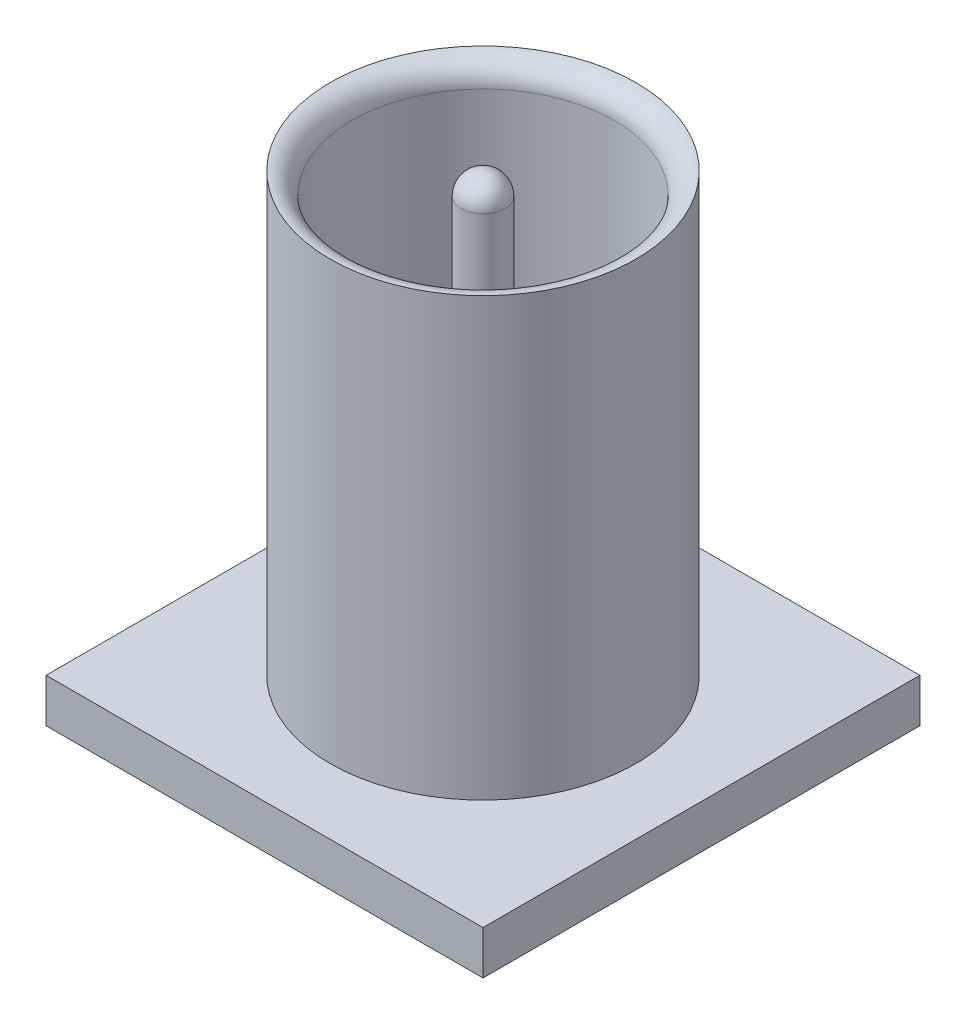
ISO-10303-21;
HEADER;
FILE_DESCRIPTION(('STEP AP214'),'2;1');
FILE_NAME('part.step','',(''),(''),'','','');
FILE_SCHEMA(('AUTOMOTIVE_DESIGN { 1 0 10303 214 1 1 1 1 }'));
ENDSEC;
DATA;
#1=APPLICATION_CONTEXT('core data for automotive mechanical design processes');
#2=APPLICATION_PROTOCOL_DEFINITION('international standard','automotive_design',2000,#1);
#3=PRODUCT_CONTEXT('',#1,'mechanical');
#4=PRODUCT('Part','Part','',(#3));
#5=PRODUCT_RELATED_PRODUCT_CATEGORY('part','',(#4));
#6=PRODUCT_DEFINITION_FORMATION('','',#4);
#7=PRODUCT_DEFINITION_CONTEXT('part definition',#1,'design');
#8=PRODUCT_DEFINITION('design','',#6,#7);
#9=PRODUCT_DEFINITION_SHAPE('','',#8);
#10=(LENGTH_UNIT() NAMED_UNIT(*) SI_UNIT(.MILLI.,.METRE.));
#11=(NAMED_UNIT(*) PLANE_ANGLE_UNIT() SI_UNIT($,.RADIAN.));
#12=(NAMED_UNIT(*) SI_UNIT($,.STERADIAN.) SOLID_ANGLE_UNIT());
#13=UNCERTAINTY_MEASURE_WITH_UNIT(LENGTH_MEASURE(1.E-05),#10,'distance_accuracy_value','');
#14=(GEOMETRIC_REPRESENTATION_CONTEXT(3) GLOBAL_UNCERTAINTY_ASSIGNED_CONTEXT((#13)) GLOBAL_UNIT_ASSIGNED_CONTEXT((#10,
#11,#12)) REPRESENTATION_CONTEXT('',''));
#15=CARTESIAN_POINT('',(0.,0.,0.));
#16=DIRECTION('',(0.,0.,1.));
#17=DIRECTION('',(1.,0.,0.));
#18=AXIS2_PLACEMENT_3D('',#15,#16,#17);
#19=CARTESIAN_POINT('',(0.,1.,0.));
#20=DIRECTION('',(0.,1.,0.));
#21=DIRECTION('',(0.,0.,1.));
#22=AXIS2_PLACEMENT_3D('',#19,#20,#21);
#23=PLANE('',#22);
#24=CARTESIAN_POINT('',(0.,1.,0.));
#25=DIRECTION('',(0.,1.,0.));
#26=DIRECTION('',(0.,0.,1.));
#27=AXIS2_PLACEMENT_3D('',#24,#25,#26);
#28=CIRCLE('',#27,3.);
#29=CARTESIAN_POINT('',(0.,1.,3.));
#30=VERTEX_POINT('',#29);
#31=EDGE_CURVE('E120',#30,#30,#28,.T.);
#32=ORIENTED_EDGE('',*,*,#31,.T.);
#33=EDGE_LOOP('',(#32));
#34=FACE_BOUND('',#33,.T.);
#35=CARTESIAN_POINT('',(0.,1.,0.));
#36=DIRECTION('',(0.,1.,0.));
#37=DIRECTION('',(0.,0.,1.));
#38=AXIS2_PLACEMENT_3D('',#35,#36,#37);
#39=CIRCLE('',#38,0.5);
#40=CARTESIAN_POINT('',(0.,1.,0.5));
#41=VERTEX_POINT('',#40);
#42=EDGE_CURVE('E117',#41,#41,#39,.T.);
#43=ORIENTED_EDGE('',*,*,#42,.F.);
#44=EDGE_LOOP('',(#43));
#45=FACE_BOUND('',#44,.T.);
#46=ADVANCED_FACE('F37',(#34,#45),#23,.T.);
#47=CARTESIAN_POINT('',(0.,10.,0.));
#48=DIRECTION('',(0.,-1.,0.));
#49=DIRECTION('',(0.,0.,-1.));
#50=AXIS2_PLACEMENT_3D('',#47,#48,#49);
#51=CYLINDRICAL_SURFACE('',#50,3.5);
#52=CARTESIAN_POINT('',(0.,10.,0.));
#53=DIRECTION('',(0.,1.,0.));
#54=DIRECTION('',(0.,0.,1.));
#55=AXIS2_PLACEMENT_3D('',#52,#53,#54);
#56=CIRCLE('',#55,3.5);
#57=CARTESIAN_POINT('',(0.,10.,3.5));
#58=VERTEX_POINT('',#57);
#59=EDGE_CURVE('E123',#58,#58,#56,.T.);
#60=ORIENTED_EDGE('',*,*,#59,.F.);
#61=EDGE_LOOP('',(#60));
#62=FACE_BOUND('',#61,.T.);
#63=CARTESIAN_POINT('',(0.,0.,0.));
#64=DIRECTION('',(0.,-1.,0.));
#65=DIRECTION('',(0.,0.,-1.));
#66=AXIS2_PLACEMENT_3D('',#63,#64,#65);
#67=CIRCLE('',#66,3.5);
#68=CARTESIAN_POINT('',(0.,0.,-3.5));
#69=VERTEX_POINT('',#68);
#70=EDGE_CURVE('E114',#69,#69,#67,.T.);
#71=ORIENTED_EDGE('',*,*,#70,.F.);
#72=EDGE_LOOP('',(#71));
#73=FACE_BOUND('',#72,.T.);
#74=ADVANCED_FACE('F143',(#62,#73),#51,.T.);
#75=CARTESIAN_POINT('',(0.,1.,0.));
#76=DIRECTION('',(0.,1.,0.));
#77=DIRECTION('',(0.,0.,1.));
#78=AXIS2_PLACEMENT_3D('',#75,#76,#77);
#79=CYLINDRICAL_SURFACE('',#78,3.);
#80=CARTESIAN_POINT('',(0.,9.5,0.));
#81=DIRECTION('',(0.,1.,0.));
#82=DIRECTION('',(0.,0.,1.));
#83=AXIS2_PLACEMENT_3D('',#80,#81,#82);
#84=CIRCLE('',#83,3.);
#85=CARTESIAN_POINT('',(0.,9.5,3.));
#86=VERTEX_POINT('',#85);
#87=EDGE_CURVE('E11',#86,#86,#84,.T.);
#88=ORIENTED_EDGE('',*,*,#87,.T.);
#89=EDGE_LOOP('',(#88));
#90=FACE_BOUND('',#89,.T.);
#91=ORIENTED_EDGE('',*,*,#31,.F.);
#92=EDGE_LOOP('',(#91));
#93=FACE_BOUND('',#92,.T.);
#94=ADVANCED_FACE('F139',(#90,#93),#79,.F.);
#95=CARTESIAN_POINT('',(0.,10.,0.));
#96=DIRECTION('',(0.,-1.,0.));
#97=DIRECTION('',(0.,0.,-1.));
#98=AXIS2_PLACEMENT_3D('',#95,#96,#97);
#99=CYLINDRICAL_SURFACE('',#98,0.5);
#100=CARTESIAN_POINT('',(0.,9.5,0.));
#101=DIRECTION('',(0.,-1.,0.));
#102=DIRECTION('',(0.,0.,-1.));
#103=AXIS2_PLACEMENT_3D('',#100,#101,#102);
#104=CIRCLE('',#103,0.5);
#105=CARTESIAN_POINT('',(0.,9.5,-0.5));
#106=VERTEX_POINT('',#105);
#107=EDGE_CURVE('E46',#106,#106,#104,.T.);
#108=ORIENTED_EDGE('',*,*,#107,.T.);
#109=EDGE_LOOP('',(#108));
#110=FACE_BOUND('',#109,.T.);
#111=ORIENTED_EDGE('',*,*,#42,.T.);
#112=EDGE_LOOP('',(#111));
#113=FACE_BOUND('',#112,.T.);
#114=ADVANCED_FACE('F128',(#110,#113),#99,.T.);
#115=CARTESIAN_POINT('',(0.,9.5,0.));
#116=DIRECTION('',(0.,0.,1.));
#117=DIRECTION('',(1.,0.,0.));
#118=AXIS2_PLACEMENT_3D('',#115,#116,#117);
#119=SPHERICAL_SURFACE('',#118,0.5);
#120=CARTESIAN_POINT('',(0.,9.5,0.));
#121=DIRECTION('',(0.,-1.,0.));
#122=DIRECTION('',(0.,0.,-1.));
#123=AXIS2_PLACEMENT_3D('',#120,#121,#122);
#124=SPHERICAL_SURFACE('',#123,0.5);
#125=ORIENTED_EDGE('',*,*,#107,.F.);
#126=EDGE_LOOP('',(#125));
#127=FACE_BOUND('',#126,.T.);
#128=ADVANCED_FACE('F131',(#127),#124,.T.);
#129=CARTESIAN_POINT('',(0.,9.5,0.));
#130=DIRECTION('',(0.,1.,0.));
#131=DIRECTION('',(0.,0.,1.));
#132=AXIS2_PLACEMENT_3D('',#129,#130,#131);
#133=TOROIDAL_SURFACE('',#132,3.5,0.5);
#134=ORIENTED_EDGE('',*,*,#59,.T.);
#135=EDGE_LOOP('',(#134));
#136=FACE_BOUND('',#135,.T.);
#137=ORIENTED_EDGE('',*,*,#87,.F.);
#138=EDGE_LOOP('',(#137));
#139=FACE_BOUND('',#138,.T.);
#140=ADVANCED_FACE('F39',(#136,#139),#133,.T.);
#141=CARTESIAN_POINT('',(0.,0.,0.));
#142=DIRECTION('',(0.,-1.,0.));
#143=DIRECTION('',(0.,0.,-1.));
#144=AXIS2_PLACEMENT_3D('',#141,#142,#143);
#145=PLANE('',#144);
#146=DIRECTION('',(0.,0.,-1.));
#147=VECTOR('',#146,1.);
#148=CARTESIAN_POINT('',(-5.,0.,-5.));
#149=LINE('',#148,#147);
#150=CARTESIAN_POINT('',(-5.,0.,5.));
#151=VERTEX_POINT('',#150);
#152=CARTESIAN_POINT('',(-5.,0.,-5.));
#153=VERTEX_POINT('',#152);
#154=EDGE_CURVE('E105',#151,#153,#149,.T.);
#155=ORIENTED_EDGE('',*,*,#154,.F.);
#156=DIRECTION('',(-1.,0.,0.));
#157=VECTOR('',#156,1.);
#158=CARTESIAN_POINT('',(5.,0.,5.));
#159=LINE('',#158,#157);
#160=CARTESIAN_POINT('',(5.,0.,5.));
#161=VERTEX_POINT('',#160);
#162=EDGE_CURVE('E77',#161,#151,#159,.T.);
#163=ORIENTED_EDGE('',*,*,#162,.F.);
#164=DIRECTION('',(0.,0.,1.));
#165=VECTOR('',#164,1.);
#166=CARTESIAN_POINT('',(5.,0.,-5.));
#167=LINE('',#166,#165);
#168=CARTESIAN_POINT('',(5.,0.,-5.));
#169=VERTEX_POINT('',#168);
#170=EDGE_CURVE('E71',#169,#161,#167,.T.);
#171=ORIENTED_EDGE('',*,*,#170,.F.);
#172=DIRECTION('',(1.,0.,0.));
#173=VECTOR('',#172,1.);
#174=CARTESIAN_POINT('',(5.,0.,-5.));
#175=LINE('',#174,#173);
#176=EDGE_CURVE('E95',#153,#169,#175,.T.);
#177=ORIENTED_EDGE('',*,*,#176,.F.);
#178=EDGE_LOOP('',(#155,#163,#171,#177));
#179=FACE_BOUND('',#178,.T.);
#180=ORIENTED_EDGE('',*,*,#70,.T.);
#181=EDGE_LOOP('',(#180));
#182=FACE_BOUND('',#181,.T.);
#183=ADVANCED_FACE('F137',(#179,#182),#145,.F.);
#184=CARTESIAN_POINT('',(-5.,-1.,-5.));
#185=DIRECTION('',(1.,0.,0.));
#186=DIRECTION('',(0.,0.,-1.));
#187=AXIS2_PLACEMENT_3D('',#184,#185,#186);
#188=PLANE('',#187);
#189=ORIENTED_EDGE('',*,*,#154,.T.);
#190=DIRECTION('',(0.,1.,0.));
#191=VECTOR('',#190,1.);
#192=CARTESIAN_POINT('',(-5.,-1.,-5.));
#193=LINE('',#192,#191);
#194=CARTESIAN_POINT('',(-5.,-1.,-5.));
#195=VERTEX_POINT('',#194);
#196=EDGE_CURVE('E96',#195,#153,#193,.T.);
#197=ORIENTED_EDGE('',*,*,#196,.F.);
#198=DIRECTION('',(0.,0.,-1.));
#199=VECTOR('',#198,1.);
#200=CARTESIAN_POINT('',(-5.,-1.,-5.));
#201=LINE('',#200,#199);
#202=CARTESIAN_POINT('',(-5.,-1.,5.));
#203=VERTEX_POINT('',#202);
#204=EDGE_CURVE('E90',#203,#195,#201,.T.);
#205=ORIENTED_EDGE('',*,*,#204,.F.);
#206=DIRECTION('',(0.,1.,0.));
#207=VECTOR('',#206,1.);
#208=CARTESIAN_POINT('',(-5.,-1.,5.));
#209=LINE('',#208,#207);
#210=EDGE_CURVE('E101',#203,#151,#209,.T.);
#211=ORIENTED_EDGE('',*,*,#210,.T.);
#212=EDGE_LOOP('',(#189,#197,#205,#211));
#213=FACE_BOUND('',#212,.T.);
#214=ADVANCED_FACE('F187',(#213),#188,.F.);
#215=CARTESIAN_POINT('',(5.,-1.,-5.));
#216=DIRECTION('',(0.,0.,1.));
#217=DIRECTION('',(1.,0.,0.));
#218=AXIS2_PLACEMENT_3D('',#215,#216,#217);
#219=PLANE('',#218);
#220=ORIENTED_EDGE('',*,*,#176,.T.);
#221=DIRECTION('',(0.,1.,0.));
#222=VECTOR('',#221,1.);
#223=CARTESIAN_POINT('',(5.,-1.,-5.));
#224=LINE('',#223,#222);
#225=CARTESIAN_POINT('',(5.,-1.,-5.));
#226=VERTEX_POINT('',#225);
#227=EDGE_CURVE('E93',#226,#169,#224,.T.);
#228=ORIENTED_EDGE('',*,*,#227,.F.);
#229=DIRECTION('',(1.,0.,0.));
#230=VECTOR('',#229,1.);
#231=CARTESIAN_POINT('',(5.,-1.,-5.));
#232=LINE('',#231,#230);
#233=EDGE_CURVE('E85',#195,#226,#232,.T.);
#234=ORIENTED_EDGE('',*,*,#233,.F.);
#235=ORIENTED_EDGE('',*,*,#196,.T.);
#236=EDGE_LOOP('',(#220,#228,#234,#235));
#237=FACE_BOUND('',#236,.T.);
#238=ADVANCED_FACE('F94',(#237),#219,.F.);
#239=CARTESIAN_POINT('',(5.,-1.,-5.));
#240=DIRECTION('',(-1.,0.,0.));
#241=DIRECTION('',(0.,0.,1.));
#242=AXIS2_PLACEMENT_3D('',#239,#240,#241);
#243=PLANE('',#242);
#244=ORIENTED_EDGE('',*,*,#170,.T.);
#245=DIRECTION('',(0.,1.,0.));
#246=VECTOR('',#245,1.);
#247=CARTESIAN_POINT('',(5.,-1.,5.));
#248=LINE('',#247,#246);
#249=CARTESIAN_POINT('',(5.,-1.,5.));
#250=VERTEX_POINT('',#249);
#251=EDGE_CURVE('E97',#250,#161,#248,.T.);
#252=ORIENTED_EDGE('',*,*,#251,.F.);
#253=DIRECTION('',(0.,0.,1.));
#254=VECTOR('',#253,1.);
#255=CARTESIAN_POINT('',(5.,-1.,-5.));
#256=LINE('',#255,#254);
#257=EDGE_CURVE('E88',#226,#250,#256,.T.);
#258=ORIENTED_EDGE('',*,*,#257,.F.);
#259=ORIENTED_EDGE('',*,*,#227,.T.);
#260=EDGE_LOOP('',(#244,#252,#258,#259));
#261=FACE_BOUND('',#260,.T.);
#262=ADVANCED_FACE('F99',(#261),#243,.F.);
#263=CARTESIAN_POINT('',(5.,-1.,5.));
#264=DIRECTION('',(0.,0.,-1.));
#265=DIRECTION('',(-1.,0.,0.));
#266=AXIS2_PLACEMENT_3D('',#263,#264,#265);
#267=PLANE('',#266);
#268=ORIENTED_EDGE('',*,*,#162,.T.);
#269=ORIENTED_EDGE('',*,*,#210,.F.);
#270=DIRECTION('',(-1.,0.,0.));
#271=VECTOR('',#270,1.);
#272=CARTESIAN_POINT('',(5.,-1.,5.));
#273=LINE('',#272,#271);
#274=EDGE_CURVE('E54',#250,#203,#273,.T.);
#275=ORIENTED_EDGE('',*,*,#274,.F.);
#276=ORIENTED_EDGE('',*,*,#251,.T.);
#277=EDGE_LOOP('',(#268,#269,#275,#276));
#278=FACE_BOUND('',#277,.T.);
#279=ADVANCED_FACE('F213',(#278),#267,.F.);
#280=CARTESIAN_POINT('',(0.,-1.,0.));
#281=DIRECTION('',(0.,-1.,0.));
#282=DIRECTION('',(0.,0.,-1.));
#283=AXIS2_PLACEMENT_3D('',#280,#281,#282);
#284=PLANE('',#283);
#285=ORIENTED_EDGE('',*,*,#204,.T.);
#286=ORIENTED_EDGE('',*,*,#233,.T.);
#287=ORIENTED_EDGE('',*,*,#257,.T.);
#288=ORIENTED_EDGE('',*,*,#274,.T.);
#289=EDGE_LOOP('',(#285,#286,#287,#288));
#290=FACE_BOUND('',#289,.T.);
#291=ADVANCED_FACE('F86',(#290),#284,.T.);
#292=CLOSED_SHELL('',(#46,#74,#94,#114,#128,#140,#183,#214,#238,#262,#279,#291));
#293=MANIFOLD_SOLID_BREP('B2',#292);
#294=ADVANCED_BREP_SHAPE_REPRESENTATION('',(#18,#293),#14);
#295=SHAPE_DEFINITION_REPRESENTATION(#9,#294);
ENDSEC;
END-ISO-10303-21;
